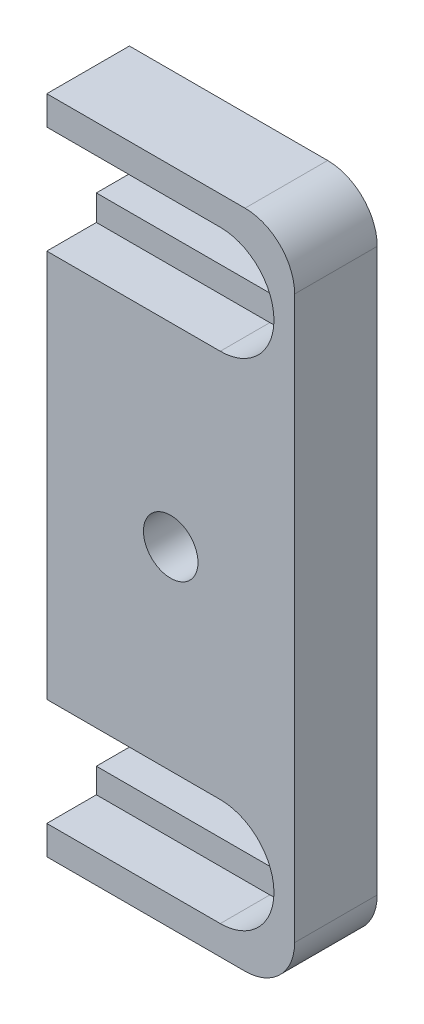
ISO-10303-21;
HEADER;
FILE_DESCRIPTION(('STEP AP214'),'2;1');
FILE_NAME('part.step','',(''),(''),'','','');
FILE_SCHEMA(('AUTOMOTIVE_DESIGN { 1 0 10303 214 1 1 1 1 }'));
ENDSEC;
DATA;
#1=APPLICATION_CONTEXT('core data for automotive mechanical design processes');
#2=APPLICATION_PROTOCOL_DEFINITION('international standard','automotive_design',2000,#1);
#3=PRODUCT_CONTEXT('',#1,'mechanical');
#4=PRODUCT('Part','Part','',(#3));
#5=PRODUCT_RELATED_PRODUCT_CATEGORY('part','',(#4));
#6=PRODUCT_DEFINITION_FORMATION('','',#4);
#7=PRODUCT_DEFINITION_CONTEXT('part definition',#1,'design');
#8=PRODUCT_DEFINITION('design','',#6,#7);
#9=PRODUCT_DEFINITION_SHAPE('','',#8);
#10=(LENGTH_UNIT() NAMED_UNIT(*) SI_UNIT(.MILLI.,.METRE.));
#11=(NAMED_UNIT(*) PLANE_ANGLE_UNIT() SI_UNIT($,.RADIAN.));
#12=(NAMED_UNIT(*) SI_UNIT($,.STERADIAN.) SOLID_ANGLE_UNIT());
#13=UNCERTAINTY_MEASURE_WITH_UNIT(LENGTH_MEASURE(1.E-05),#10,'distance_accuracy_value','');
#14=(GEOMETRIC_REPRESENTATION_CONTEXT(3) GLOBAL_UNCERTAINTY_ASSIGNED_CONTEXT((#13)) GLOBAL_UNIT_ASSIGNED_CONTEXT((#10,
#11,#12)) REPRESENTATION_CONTEXT('',''));
#15=CARTESIAN_POINT('',(0.,0.,0.));
#16=DIRECTION('',(0.,0.,1.));
#17=DIRECTION('',(1.,0.,0.));
#18=AXIS2_PLACEMENT_3D('',#15,#16,#17);
#19=CARTESIAN_POINT('',(0.,0.,0.));
#20=DIRECTION('',(-1.,0.,0.));
#21=DIRECTION('',(0.,-1.,0.));
#22=AXIS2_PLACEMENT_3D('',#19,#20,#21);
#23=PLANE('',#22);
#24=DIRECTION('',(0.,0.,-1.));
#25=VECTOR('',#24,1.);
#26=CARTESIAN_POINT('',(0.,-36.7500000000001,5.));
#27=LINE('',#26,#25);
#28=CARTESIAN_POINT('',(0.,-36.7500000000001,2.));
#29=VERTEX_POINT('',#28);
#30=CARTESIAN_POINT('',(0.,-36.7500000000001,0.));
#31=VERTEX_POINT('',#30);
#32=EDGE_CURVE('E196',#29,#31,#27,.T.);
#33=ORIENTED_EDGE('',*,*,#32,.T.);
#34=DIRECTION('',(0.,-1.,0.));
#35=VECTOR('',#34,1.);
#36=CARTESIAN_POINT('',(0.,0.,0.));
#37=LINE('',#36,#35);
#38=CARTESIAN_POINT('',(0.,-40.,0.));
#39=VERTEX_POINT('',#38);
#40=EDGE_CURVE('E210',#31,#39,#37,.T.);
#41=ORIENTED_EDGE('',*,*,#40,.T.);
#42=DIRECTION('',(0.,0.,1.));
#43=VECTOR('',#42,1.);
#44=CARTESIAN_POINT('',(0.,-40.,0.));
#45=LINE('',#44,#43);
#46=CARTESIAN_POINT('',(0.,-40.,5.));
#47=VERTEX_POINT('',#46);
#48=EDGE_CURVE('E255',#39,#47,#45,.T.);
#49=ORIENTED_EDGE('',*,*,#48,.T.);
#50=DIRECTION('',(0.,-1.,0.));
#51=VECTOR('',#50,1.);
#52=CARTESIAN_POINT('',(0.,0.,5.));
#53=LINE('',#52,#51);
#54=CARTESIAN_POINT('',(0.,-38.25,5.));
#55=VERTEX_POINT('',#54);
#56=EDGE_CURVE('E266',#55,#47,#53,.T.);
#57=ORIENTED_EDGE('',*,*,#56,.F.);
#58=DIRECTION('',(0.,0.,1.));
#59=VECTOR('',#58,1.);
#60=CARTESIAN_POINT('',(0.,-38.25,2.));
#61=LINE('',#60,#59);
#62=CARTESIAN_POINT('',(0.,-38.25,2.));
#63=VERTEX_POINT('',#62);
#64=EDGE_CURVE('E347',#63,#55,#61,.T.);
#65=ORIENTED_EDGE('',*,*,#64,.F.);
#66=DIRECTION('',(0.,-1.,0.));
#67=VECTOR('',#66,1.);
#68=CARTESIAN_POINT('',(0.,-31.7500000000001,2.));
#69=LINE('',#68,#67);
#70=EDGE_CURVE('E213',#29,#63,#69,.T.);
#71=ORIENTED_EDGE('',*,*,#70,.F.);
#72=EDGE_LOOP('',(#33,#41,#49,#57,#65,#71));
#73=FACE_BOUND('',#72,.T.);
#74=ADVANCED_FACE('F44',(#73),#23,.T.);
#75=DIRECTION('',(0.,0.,1.));
#76=VECTOR('',#75,1.);
#77=CARTESIAN_POINT('',(0.,-3.3,0.));
#78=LINE('',#77,#76);
#79=CARTESIAN_POINT('',(0.,-3.3,0.));
#80=VERTEX_POINT('',#79);
#81=CARTESIAN_POINT('',(0.,-3.3,2.));
#82=VERTEX_POINT('',#81);
#83=EDGE_CURVE('E374',#80,#82,#78,.T.);
#84=ORIENTED_EDGE('',*,*,#83,.T.);
#85=DIRECTION('',(0.,-1.,0.));
#86=VECTOR('',#85,1.);
#87=CARTESIAN_POINT('',(0.,-1.75,2.));
#88=LINE('',#87,#86);
#89=CARTESIAN_POINT('',(0.,-1.75,2.));
#90=VERTEX_POINT('',#89);
#91=EDGE_CURVE('E394',#90,#82,#88,.T.);
#92=ORIENTED_EDGE('',*,*,#91,.F.);
#93=DIRECTION('',(0.,0.,1.));
#94=VECTOR('',#93,1.);
#95=CARTESIAN_POINT('',(0.,-1.75,2.));
#96=LINE('',#95,#94);
#97=CARTESIAN_POINT('',(0.,-1.75,5.));
#98=VERTEX_POINT('',#97);
#99=EDGE_CURVE('E263',#90,#98,#96,.T.);
#100=ORIENTED_EDGE('',*,*,#99,.T.);
#101=CARTESIAN_POINT('',(0.,0.,5.));
#102=VERTEX_POINT('',#101);
#103=EDGE_CURVE('E267',#102,#98,#53,.T.);
#104=ORIENTED_EDGE('',*,*,#103,.F.);
#105=DIRECTION('',(0.,0.,1.));
#106=VECTOR('',#105,1.);
#107=CARTESIAN_POINT('',(0.,0.,0.));
#108=LINE('',#107,#106);
#109=CARTESIAN_POINT('',(0.,0.,0.));
#110=VERTEX_POINT('',#109);
#111=EDGE_CURVE('E246',#110,#102,#108,.T.);
#112=ORIENTED_EDGE('',*,*,#111,.F.);
#113=EDGE_CURVE('E226',#110,#80,#37,.T.);
#114=ORIENTED_EDGE('',*,*,#113,.T.);
#115=EDGE_LOOP('',(#84,#92,#100,#104,#112,#114));
#116=FACE_BOUND('',#115,.T.);
#117=ADVANCED_FACE('F437',(#116),#23,.T.);
#118=CARTESIAN_POINT('',(15.,-40.,0.));
#119=DIRECTION('',(1.,0.,0.));
#120=DIRECTION('',(0.,0.,-1.));
#121=AXIS2_PLACEMENT_3D('',#118,#119,#120);
#122=PLANE('',#121);
#123=DIRECTION('',(0.,1.,0.));
#124=VECTOR('',#123,1.);
#125=CARTESIAN_POINT('',(15.,-40.,5.));
#126=LINE('',#125,#124);
#127=CARTESIAN_POINT('',(15.,-37.,5.));
#128=VERTEX_POINT('',#127);
#129=CARTESIAN_POINT('',(15.,-3.,5.));
#130=VERTEX_POINT('',#129);
#131=EDGE_CURVE('E258',#128,#130,#126,.T.);
#132=ORIENTED_EDGE('',*,*,#131,.F.);
#133=DIRECTION('',(0.,0.,1.));
#134=VECTOR('',#133,1.);
#135=CARTESIAN_POINT('',(15.,-37.,0.));
#136=LINE('',#135,#134);
#137=CARTESIAN_POINT('',(15.,-37.,0.));
#138=VERTEX_POINT('',#137);
#139=EDGE_CURVE('E298',#128,#138,#136,.F.);
#140=ORIENTED_EDGE('',*,*,#139,.T.);
#141=DIRECTION('',(0.,1.,0.));
#142=VECTOR('',#141,1.);
#143=CARTESIAN_POINT('',(15.,-40.,0.));
#144=LINE('',#143,#142);
#145=CARTESIAN_POINT('',(15.,-3.,0.));
#146=VERTEX_POINT('',#145);
#147=EDGE_CURVE('E233',#138,#146,#144,.T.);
#148=ORIENTED_EDGE('',*,*,#147,.T.);
#149=DIRECTION('',(0.,0.,1.));
#150=VECTOR('',#149,1.);
#151=CARTESIAN_POINT('',(15.,-3.,0.));
#152=LINE('',#151,#150);
#153=EDGE_CURVE('E294',#146,#130,#152,.T.);
#154=ORIENTED_EDGE('',*,*,#153,.T.);
#155=EDGE_LOOP('',(#132,#140,#148,#154));
#156=FACE_BOUND('',#155,.T.);
#157=ADVANCED_FACE('F433',(#156),#122,.T.);
#158=CARTESIAN_POINT('',(0.,-40.,0.));
#159=DIRECTION('',(0.,-1.,0.));
#160=DIRECTION('',(1.,0.,0.));
#161=AXIS2_PLACEMENT_3D('',#158,#159,#160);
#162=PLANE('',#161);
#163=DIRECTION('',(1.,0.,0.));
#164=VECTOR('',#163,1.);
#165=CARTESIAN_POINT('',(0.,-40.,0.));
#166=LINE('',#165,#164);
#167=CARTESIAN_POINT('',(12.,-40.,0.));
#168=VERTEX_POINT('',#167);
#169=EDGE_CURVE('E221',#39,#168,#166,.T.);
#170=ORIENTED_EDGE('',*,*,#169,.T.);
#171=DIRECTION('',(0.,0.,1.));
#172=VECTOR('',#171,1.);
#173=CARTESIAN_POINT('',(12.,-40.,0.));
#174=LINE('',#173,#172);
#175=CARTESIAN_POINT('',(12.,-40.,5.));
#176=VERTEX_POINT('',#175);
#177=EDGE_CURVE('E285',#168,#176,#174,.T.);
#178=ORIENTED_EDGE('',*,*,#177,.T.);
#179=DIRECTION('',(1.,0.,0.));
#180=VECTOR('',#179,1.);
#181=CARTESIAN_POINT('',(0.,-40.,5.));
#182=LINE('',#181,#180);
#183=EDGE_CURVE('E270',#47,#176,#182,.T.);
#184=ORIENTED_EDGE('',*,*,#183,.F.);
#185=ORIENTED_EDGE('',*,*,#48,.F.);
#186=EDGE_LOOP('',(#170,#178,#184,#185));
#187=FACE_BOUND('',#186,.T.);
#188=ADVANCED_FACE('F310',(#187),#162,.T.);
#189=DIRECTION('',(0.,0.,-1.));
#190=VECTOR('',#189,1.);
#191=CARTESIAN_POINT('',(0.,-33.25,5.));
#192=LINE('',#191,#190);
#193=CARTESIAN_POINT('',(0.,-33.25,2.));
#194=VERTEX_POINT('',#193);
#195=CARTESIAN_POINT('',(0.,-33.25,0.));
#196=VERTEX_POINT('',#195);
#197=EDGE_CURVE('E215',#194,#196,#192,.T.);
#198=ORIENTED_EDGE('',*,*,#197,.F.);
#199=CARTESIAN_POINT('',(0.,-31.7500000000001,2.));
#200=VERTEX_POINT('',#199);
#201=EDGE_CURVE('E342',#200,#194,#69,.T.);
#202=ORIENTED_EDGE('',*,*,#201,.F.);
#203=DIRECTION('',(0.,0.,1.));
#204=VECTOR('',#203,1.);
#205=CARTESIAN_POINT('',(0.,-31.7500000000001,2.));
#206=LINE('',#205,#204);
#207=CARTESIAN_POINT('',(0.,-31.7500000000001,5.));
#208=VERTEX_POINT('',#207);
#209=EDGE_CURVE('E340',#200,#208,#206,.T.);
#210=ORIENTED_EDGE('',*,*,#209,.T.);
#211=CARTESIAN_POINT('',(0.,-8.25,5.));
#212=VERTEX_POINT('',#211);
#213=EDGE_CURVE('E271',#212,#208,#53,.T.);
#214=ORIENTED_EDGE('',*,*,#213,.F.);
#215=DIRECTION('',(0.,0.,1.));
#216=VECTOR('',#215,1.);
#217=CARTESIAN_POINT('',(0.,-8.25,2.));
#218=LINE('',#217,#216);
#219=CARTESIAN_POINT('',(0.,-8.25,2.));
#220=VERTEX_POINT('',#219);
#221=EDGE_CURVE('E338',#220,#212,#218,.T.);
#222=ORIENTED_EDGE('',*,*,#221,.F.);
#223=CARTESIAN_POINT('',(0.,-6.7,2.));
#224=VERTEX_POINT('',#223);
#225=EDGE_CURVE('E399',#224,#220,#88,.T.);
#226=ORIENTED_EDGE('',*,*,#225,.F.);
#227=DIRECTION('',(0.,0.,1.));
#228=VECTOR('',#227,1.);
#229=CARTESIAN_POINT('',(0.,-6.7,0.));
#230=LINE('',#229,#228);
#231=CARTESIAN_POINT('',(0.,-6.7,0.));
#232=VERTEX_POINT('',#231);
#233=EDGE_CURVE('E389',#232,#224,#230,.T.);
#234=ORIENTED_EDGE('',*,*,#233,.F.);
#235=EDGE_CURVE('E223',#232,#196,#37,.T.);
#236=ORIENTED_EDGE('',*,*,#235,.T.);
#237=EDGE_LOOP('',(#198,#202,#210,#214,#222,#226,#234,#236));
#238=FACE_BOUND('',#237,.T.);
#239=ADVANCED_FACE('F336',(#238),#23,.T.);
#240=CARTESIAN_POINT('',(15.,0.,0.));
#241=DIRECTION('',(0.,1.,0.));
#242=DIRECTION('',(0.,0.,1.));
#243=AXIS2_PLACEMENT_3D('',#240,#241,#242);
#244=PLANE('',#243);
#245=DIRECTION('',(-1.,0.,0.));
#246=VECTOR('',#245,1.);
#247=CARTESIAN_POINT('',(15.,0.,5.));
#248=LINE('',#247,#246);
#249=CARTESIAN_POINT('',(12.,0.,5.));
#250=VERTEX_POINT('',#249);
#251=EDGE_CURVE('E262',#250,#102,#248,.T.);
#252=ORIENTED_EDGE('',*,*,#251,.F.);
#253=DIRECTION('',(0.,0.,1.));
#254=VECTOR('',#253,1.);
#255=CARTESIAN_POINT('',(12.,0.,0.));
#256=LINE('',#255,#254);
#257=CARTESIAN_POINT('',(12.,0.,0.));
#258=VERTEX_POINT('',#257);
#259=EDGE_CURVE('E11',#250,#258,#256,.F.);
#260=ORIENTED_EDGE('',*,*,#259,.T.);
#261=DIRECTION('',(-1.,0.,0.));
#262=VECTOR('',#261,1.);
#263=CARTESIAN_POINT('',(15.,0.,0.));
#264=LINE('',#263,#262);
#265=EDGE_CURVE('E224',#258,#110,#264,.T.);
#266=ORIENTED_EDGE('',*,*,#265,.T.);
#267=ORIENTED_EDGE('',*,*,#111,.T.);
#268=EDGE_LOOP('',(#252,#260,#266,#267));
#269=FACE_BOUND('',#268,.T.);
#270=ADVANCED_FACE('F435',(#269),#244,.T.);
#271=CARTESIAN_POINT('',(0.,0.,0.));
#272=DIRECTION('',(0.,0.,1.));
#273=DIRECTION('',(1.,0.,0.));
#274=AXIS2_PLACEMENT_3D('',#271,#272,#273);
#275=PLANE('',#274);
#276=CARTESIAN_POINT('',(7.50000000000001,-20.,0.));
#277=DIRECTION('',(0.,0.,1.));
#278=DIRECTION('',(1.,0.,0.));
#279=AXIS2_PLACEMENT_3D('',#276,#277,#278);
#280=CIRCLE('',#279,1.65);
#281=CARTESIAN_POINT('',(9.15000000000001,-20.,0.));
#282=VERTEX_POINT('',#281);
#283=EDGE_CURVE('E205',#282,#282,#280,.T.);
#284=ORIENTED_EDGE('',*,*,#283,.T.);
#285=EDGE_LOOP('',(#284));
#286=FACE_BOUND('',#285,.T.);
#287=ORIENTED_EDGE('',*,*,#147,.F.);
#288=CARTESIAN_POINT('',(12.,-37.,0.));
#289=DIRECTION('',(0.,0.,1.));
#290=DIRECTION('',(1.,0.,0.));
#291=AXIS2_PLACEMENT_3D('',#288,#289,#290);
#292=CIRCLE('',#291,3.);
#293=EDGE_CURVE('E53',#138,#168,#292,.F.);
#294=ORIENTED_EDGE('',*,*,#293,.T.);
#295=ORIENTED_EDGE('',*,*,#169,.F.);
#296=ORIENTED_EDGE('',*,*,#40,.F.);
#297=DIRECTION('',(-1.,0.,0.));
#298=VECTOR('',#297,1.);
#299=CARTESIAN_POINT('',(10.5,-36.7500000000001,0.));
#300=LINE('',#299,#298);
#301=CARTESIAN_POINT('',(10.5,-36.7500000000001,0.));
#302=VERTEX_POINT('',#301);
#303=EDGE_CURVE('E193',#302,#31,#300,.T.);
#304=ORIENTED_EDGE('',*,*,#303,.F.);
#305=CARTESIAN_POINT('',(10.5,-35.,0.));
#306=DIRECTION('',(0.,0.,-1.));
#307=DIRECTION('',(-1.,0.,0.));
#308=AXIS2_PLACEMENT_3D('',#305,#306,#307);
#309=CIRCLE('',#308,1.75000000000003);
#310=CARTESIAN_POINT('',(10.5,-33.25,0.));
#311=VERTEX_POINT('',#310);
#312=EDGE_CURVE('E216',#311,#302,#309,.T.);
#313=ORIENTED_EDGE('',*,*,#312,.F.);
#314=DIRECTION('',(1.,0.,0.));
#315=VECTOR('',#314,1.);
#316=CARTESIAN_POINT('',(0.,-33.25,0.));
#317=LINE('',#316,#315);
#318=EDGE_CURVE('E204',#196,#311,#317,.T.);
#319=ORIENTED_EDGE('',*,*,#318,.F.);
#320=ORIENTED_EDGE('',*,*,#235,.F.);
#321=DIRECTION('',(1.,0.,0.));
#322=VECTOR('',#321,1.);
#323=CARTESIAN_POINT('',(0.,-6.7,0.));
#324=LINE('',#323,#322);
#325=CARTESIAN_POINT('',(10.5,-6.7,0.));
#326=VERTEX_POINT('',#325);
#327=EDGE_CURVE('E365',#232,#326,#324,.T.);
#328=ORIENTED_EDGE('',*,*,#327,.T.);
#329=CARTESIAN_POINT('',(10.5,-5.,0.));
#330=DIRECTION('',(0.,0.,1.));
#331=DIRECTION('',(1.,0.,0.));
#332=AXIS2_PLACEMENT_3D('',#329,#330,#331);
#333=CIRCLE('',#332,1.7);
#334=CARTESIAN_POINT('',(10.5,-3.30000000000001,0.));
#335=VERTEX_POINT('',#334);
#336=EDGE_CURVE('E370',#326,#335,#333,.T.);
#337=ORIENTED_EDGE('',*,*,#336,.T.);
#338=DIRECTION('',(-1.,0.,0.));
#339=VECTOR('',#338,1.);
#340=CARTESIAN_POINT('',(10.5,-3.3,0.));
#341=LINE('',#340,#339);
#342=EDGE_CURVE('E361',#335,#80,#341,.T.);
#343=ORIENTED_EDGE('',*,*,#342,.T.);
#344=ORIENTED_EDGE('',*,*,#113,.F.);
#345=ORIENTED_EDGE('',*,*,#265,.F.);
#346=CARTESIAN_POINT('',(12.,-3.,0.));
#347=DIRECTION('',(0.,0.,1.));
#348=DIRECTION('',(1.,0.,0.));
#349=AXIS2_PLACEMENT_3D('',#346,#347,#348);
#350=CIRCLE('',#349,3.);
#351=EDGE_CURVE('E65',#258,#146,#350,.F.);
#352=ORIENTED_EDGE('',*,*,#351,.T.);
#353=EDGE_LOOP('',(#287,#294,#295,#296,#304,#313,#319,#320,#328,#337,#343,#344,#345,#352));
#354=FACE_BOUND('',#353,.T.);
#355=ADVANCED_FACE('F219',(#286,#354),#275,.F.);
#356=CARTESIAN_POINT('',(0.,0.,5.));
#357=DIRECTION('',(0.,0.,1.));
#358=DIRECTION('',(1.,0.,0.));
#359=AXIS2_PLACEMENT_3D('',#356,#357,#358);
#360=PLANE('',#359);
#361=CARTESIAN_POINT('',(7.50000000000001,-20.,5.));
#362=DIRECTION('',(0.,0.,1.));
#363=DIRECTION('',(1.,0.,0.));
#364=AXIS2_PLACEMENT_3D('',#361,#362,#363);
#365=CIRCLE('',#364,1.65);
#366=CARTESIAN_POINT('',(9.15000000000001,-20.,5.));
#367=VERTEX_POINT('',#366);
#368=EDGE_CURVE('E586',#367,#367,#365,.T.);
#369=ORIENTED_EDGE('',*,*,#368,.F.);
#370=EDGE_LOOP('',(#369));
#371=FACE_BOUND('',#370,.T.);
#372=ORIENTED_EDGE('',*,*,#183,.T.);
#373=CARTESIAN_POINT('',(12.,-37.,5.));
#374=DIRECTION('',(0.,0.,1.));
#375=DIRECTION('',(1.,0.,0.));
#376=AXIS2_PLACEMENT_3D('',#373,#374,#375);
#377=CIRCLE('',#376,3.);
#378=EDGE_CURVE('E291',#176,#128,#377,.T.);
#379=ORIENTED_EDGE('',*,*,#378,.T.);
#380=ORIENTED_EDGE('',*,*,#131,.T.);
#381=CARTESIAN_POINT('',(12.,-3.,5.));
#382=DIRECTION('',(0.,0.,1.));
#383=DIRECTION('',(1.,0.,0.));
#384=AXIS2_PLACEMENT_3D('',#381,#382,#383);
#385=CIRCLE('',#384,3.);
#386=EDGE_CURVE('E288',#130,#250,#385,.T.);
#387=ORIENTED_EDGE('',*,*,#386,.T.);
#388=ORIENTED_EDGE('',*,*,#251,.T.);
#389=ORIENTED_EDGE('',*,*,#103,.T.);
#390=DIRECTION('',(-1.,0.,0.));
#391=VECTOR('',#390,1.);
#392=CARTESIAN_POINT('',(10.5,-1.75,5.));
#393=LINE('',#392,#391);
#394=CARTESIAN_POINT('',(10.5,-1.75,5.));
#395=VERTEX_POINT('',#394);
#396=EDGE_CURVE('E416',#395,#98,#393,.T.);
#397=ORIENTED_EDGE('',*,*,#396,.F.);
#398=CARTESIAN_POINT('',(10.5,-5.,5.));
#399=DIRECTION('',(0.,0.,1.));
#400=DIRECTION('',(1.,0.,0.));
#401=AXIS2_PLACEMENT_3D('',#398,#399,#400);
#402=CIRCLE('',#401,3.25);
#403=CARTESIAN_POINT('',(10.5,-8.25,5.));
#404=VERTEX_POINT('',#403);
#405=EDGE_CURVE('E412',#404,#395,#402,.T.);
#406=ORIENTED_EDGE('',*,*,#405,.F.);
#407=DIRECTION('',(1.,0.,0.));
#408=VECTOR('',#407,1.);
#409=CARTESIAN_POINT('',(0.,-8.25,5.));
#410=LINE('',#409,#408);
#411=EDGE_CURVE('E331',#212,#404,#410,.T.);
#412=ORIENTED_EDGE('',*,*,#411,.F.);
#413=ORIENTED_EDGE('',*,*,#213,.T.);
#414=DIRECTION('',(-1.,0.,0.));
#415=VECTOR('',#414,1.);
#416=CARTESIAN_POINT('',(10.5,-31.7500000000001,5.));
#417=LINE('',#416,#415);
#418=CARTESIAN_POINT('',(10.5,-31.7500000000001,5.));
#419=VERTEX_POINT('',#418);
#420=EDGE_CURVE('E328',#419,#208,#417,.T.);
#421=ORIENTED_EDGE('',*,*,#420,.F.);
#422=CARTESIAN_POINT('',(10.5,-35.,5.));
#423=DIRECTION('',(0.,0.,1.));
#424=DIRECTION('',(1.,0.,0.));
#425=AXIS2_PLACEMENT_3D('',#422,#423,#424);
#426=CIRCLE('',#425,3.24999999999998);
#427=CARTESIAN_POINT('',(10.5,-38.25,5.));
#428=VERTEX_POINT('',#427);
#429=EDGE_CURVE('E556',#428,#419,#426,.T.);
#430=ORIENTED_EDGE('',*,*,#429,.F.);
#431=DIRECTION('',(1.,0.,0.));
#432=VECTOR('',#431,1.);
#433=CARTESIAN_POINT('',(0.,-38.25,5.));
#434=LINE('',#433,#432);
#435=EDGE_CURVE('E318',#55,#428,#434,.T.);
#436=ORIENTED_EDGE('',*,*,#435,.F.);
#437=ORIENTED_EDGE('',*,*,#56,.T.);
#438=EDGE_LOOP('',(#372,#379,#380,#387,#388,#389,#397,#406,#412,#413,#421,#430,#436,#437));
#439=FACE_BOUND('',#438,.T.);
#440=ADVANCED_FACE('F312',(#371,#439),#360,.T.);
#441=CARTESIAN_POINT('',(10.5,-1.75,2.));
#442=DIRECTION('',(0.,1.,0.));
#443=DIRECTION('',(-1.,0.,0.));
#444=AXIS2_PLACEMENT_3D('',#441,#442,#443);
#445=PLANE('',#444);
#446=ORIENTED_EDGE('',*,*,#396,.T.);
#447=ORIENTED_EDGE('',*,*,#99,.F.);
#448=DIRECTION('',(-1.,0.,0.));
#449=VECTOR('',#448,1.);
#450=CARTESIAN_POINT('',(10.5,-1.75,2.));
#451=LINE('',#450,#449);
#452=CARTESIAN_POINT('',(10.5,-1.75,2.));
#453=VERTEX_POINT('',#452);
#454=EDGE_CURVE('E406',#453,#90,#451,.T.);
#455=ORIENTED_EDGE('',*,*,#454,.F.);
#456=DIRECTION('',(0.,0.,1.));
#457=VECTOR('',#456,1.);
#458=CARTESIAN_POINT('',(10.5,-1.75,2.));
#459=LINE('',#458,#457);
#460=EDGE_CURVE('E422',#453,#395,#459,.T.);
#461=ORIENTED_EDGE('',*,*,#460,.T.);
#462=EDGE_LOOP('',(#446,#447,#455,#461));
#463=FACE_BOUND('',#462,.T.);
#464=ADVANCED_FACE('F441',(#463),#445,.F.);
#465=CARTESIAN_POINT('',(10.5,-5.,2.));
#466=DIRECTION('',(0.,0.,1.));
#467=DIRECTION('',(1.,0.,0.));
#468=AXIS2_PLACEMENT_3D('',#465,#466,#467);
#469=CYLINDRICAL_SURFACE('',#468,3.25);
#470=ORIENTED_EDGE('',*,*,#405,.T.);
#471=ORIENTED_EDGE('',*,*,#460,.F.);
#472=CARTESIAN_POINT('',(10.5,-5.,2.));
#473=DIRECTION('',(0.,0.,1.));
#474=DIRECTION('',(1.,0.,0.));
#475=AXIS2_PLACEMENT_3D('',#472,#473,#474);
#476=CIRCLE('',#475,3.25);
#477=CARTESIAN_POINT('',(10.5,-8.25,2.));
#478=VERTEX_POINT('',#477);
#479=EDGE_CURVE('E403',#478,#453,#476,.T.);
#480=ORIENTED_EDGE('',*,*,#479,.F.);
#481=DIRECTION('',(0.,0.,1.));
#482=VECTOR('',#481,1.);
#483=CARTESIAN_POINT('',(10.5,-8.25,2.));
#484=LINE('',#483,#482);
#485=EDGE_CURVE('E425',#478,#404,#484,.T.);
#486=ORIENTED_EDGE('',*,*,#485,.T.);
#487=EDGE_LOOP('',(#470,#471,#480,#486));
#488=FACE_BOUND('',#487,.T.);
#489=ADVANCED_FACE('F445',(#488),#469,.F.);
#490=CARTESIAN_POINT('',(0.,-8.25,2.));
#491=DIRECTION('',(0.,-1.,0.));
#492=DIRECTION('',(0.,0.,-1.));
#493=AXIS2_PLACEMENT_3D('',#490,#491,#492);
#494=PLANE('',#493);
#495=ORIENTED_EDGE('',*,*,#411,.T.);
#496=ORIENTED_EDGE('',*,*,#485,.F.);
#497=DIRECTION('',(1.,0.,0.));
#498=VECTOR('',#497,1.);
#499=CARTESIAN_POINT('',(0.,-8.25,2.));
#500=LINE('',#499,#498);
#501=EDGE_CURVE('E398',#220,#478,#500,.T.);
#502=ORIENTED_EDGE('',*,*,#501,.F.);
#503=ORIENTED_EDGE('',*,*,#221,.T.);
#504=EDGE_LOOP('',(#495,#496,#502,#503));
#505=FACE_BOUND('',#504,.T.);
#506=ADVANCED_FACE('F448',(#505),#494,.F.);
#507=CARTESIAN_POINT('',(10.5,-5.,2.));
#508=DIRECTION('',(0.,0.,1.));
#509=DIRECTION('',(1.,0.,0.));
#510=AXIS2_PLACEMENT_3D('',#507,#508,#509);
#511=PLANE('',#510);
#512=DIRECTION('',(-1.,0.,0.));
#513=VECTOR('',#512,1.);
#514=CARTESIAN_POINT('',(10.5,-3.3,2.));
#515=LINE('',#514,#513);
#516=CARTESIAN_POINT('',(10.5,-3.30000000000001,2.));
#517=VERTEX_POINT('',#516);
#518=EDGE_CURVE('E375',#517,#82,#515,.T.);
#519=ORIENTED_EDGE('',*,*,#518,.F.);
#520=CARTESIAN_POINT('',(10.5,-5.,2.));
#521=DIRECTION('',(0.,0.,1.));
#522=DIRECTION('',(1.,0.,0.));
#523=AXIS2_PLACEMENT_3D('',#520,#521,#522);
#524=CIRCLE('',#523,1.7);
#525=CARTESIAN_POINT('',(10.5,-6.7,2.));
#526=VERTEX_POINT('',#525);
#527=EDGE_CURVE('E366',#526,#517,#524,.T.);
#528=ORIENTED_EDGE('',*,*,#527,.F.);
#529=DIRECTION('',(1.,0.,0.));
#530=VECTOR('',#529,1.);
#531=CARTESIAN_POINT('',(0.,-6.7,2.));
#532=LINE('',#531,#530);
#533=EDGE_CURVE('E377',#224,#526,#532,.T.);
#534=ORIENTED_EDGE('',*,*,#533,.F.);
#535=ORIENTED_EDGE('',*,*,#225,.T.);
#536=ORIENTED_EDGE('',*,*,#501,.T.);
#537=ORIENTED_EDGE('',*,*,#479,.T.);
#538=ORIENTED_EDGE('',*,*,#454,.T.);
#539=ORIENTED_EDGE('',*,*,#91,.T.);
#540=EDGE_LOOP('',(#519,#528,#534,#535,#536,#537,#538,#539));
#541=FACE_BOUND('',#540,.T.);
#542=ADVANCED_FACE('F451',(#541),#511,.T.);
#543=CARTESIAN_POINT('',(10.5,-3.3,0.));
#544=DIRECTION('',(0.,1.,0.));
#545=DIRECTION('',(-1.,0.,0.));
#546=AXIS2_PLACEMENT_3D('',#543,#544,#545);
#547=PLANE('',#546);
#548=ORIENTED_EDGE('',*,*,#518,.T.);
#549=ORIENTED_EDGE('',*,*,#83,.F.);
#550=ORIENTED_EDGE('',*,*,#342,.F.);
#551=DIRECTION('',(0.,0.,1.));
#552=VECTOR('',#551,1.);
#553=CARTESIAN_POINT('',(10.5,-3.30000000000001,0.));
#554=LINE('',#553,#552);
#555=EDGE_CURVE('E384',#335,#517,#554,.T.);
#556=ORIENTED_EDGE('',*,*,#555,.T.);
#557=EDGE_LOOP('',(#548,#549,#550,#556));
#558=FACE_BOUND('',#557,.T.);
#559=ADVANCED_FACE('F662',(#558),#547,.F.);
#560=CARTESIAN_POINT('',(10.5,-5.,0.));
#561=DIRECTION('',(0.,0.,1.));
#562=DIRECTION('',(1.,0.,0.));
#563=AXIS2_PLACEMENT_3D('',#560,#561,#562);
#564=CYLINDRICAL_SURFACE('',#563,1.7);
#565=ORIENTED_EDGE('',*,*,#527,.T.);
#566=ORIENTED_EDGE('',*,*,#555,.F.);
#567=ORIENTED_EDGE('',*,*,#336,.F.);
#568=DIRECTION('',(0.,0.,1.));
#569=VECTOR('',#568,1.);
#570=CARTESIAN_POINT('',(10.5,-6.7,0.));
#571=LINE('',#570,#569);
#572=EDGE_CURVE('E387',#326,#526,#571,.T.);
#573=ORIENTED_EDGE('',*,*,#572,.T.);
#574=EDGE_LOOP('',(#565,#566,#567,#573));
#575=FACE_BOUND('',#574,.T.);
#576=ADVANCED_FACE('F659',(#575),#564,.F.);
#577=CARTESIAN_POINT('',(0.,-6.7,0.));
#578=DIRECTION('',(0.,-1.,0.));
#579=DIRECTION('',(1.,0.,0.));
#580=AXIS2_PLACEMENT_3D('',#577,#578,#579);
#581=PLANE('',#580);
#582=ORIENTED_EDGE('',*,*,#533,.T.);
#583=ORIENTED_EDGE('',*,*,#572,.F.);
#584=ORIENTED_EDGE('',*,*,#327,.F.);
#585=ORIENTED_EDGE('',*,*,#233,.T.);
#586=EDGE_LOOP('',(#582,#583,#584,#585));
#587=FACE_BOUND('',#586,.T.);
#588=ADVANCED_FACE('F657',(#587),#581,.F.);
#589=CARTESIAN_POINT('',(10.5,-35.,2.));
#590=DIRECTION('',(0.,0.,1.));
#591=DIRECTION('',(1.,0.,0.));
#592=AXIS2_PLACEMENT_3D('',#589,#590,#591);
#593=CYLINDRICAL_SURFACE('',#592,3.24999999999998);
#594=ORIENTED_EDGE('',*,*,#429,.T.);
#595=DIRECTION('',(0.,0.,1.));
#596=VECTOR('',#595,1.);
#597=CARTESIAN_POINT('',(10.5,-31.7500000000001,2.));
#598=LINE('',#597,#596);
#599=CARTESIAN_POINT('',(10.5,-31.7500000000001,2.));
#600=VERTEX_POINT('',#599);
#601=EDGE_CURVE('E348',#600,#419,#598,.T.);
#602=ORIENTED_EDGE('',*,*,#601,.F.);
#603=CARTESIAN_POINT('',(10.5,-35.,2.));
#604=DIRECTION('',(0.,0.,1.));
#605=DIRECTION('',(1.,0.,0.));
#606=AXIS2_PLACEMENT_3D('',#603,#604,#605);
#607=CIRCLE('',#606,3.24999999999998);
#608=CARTESIAN_POINT('',(10.5,-38.25,2.));
#609=VERTEX_POINT('',#608);
#610=EDGE_CURVE('E545',#609,#600,#607,.T.);
#611=ORIENTED_EDGE('',*,*,#610,.F.);
#612=DIRECTION('',(0.,0.,1.));
#613=VECTOR('',#612,1.);
#614=CARTESIAN_POINT('',(10.5,-38.25,2.));
#615=LINE('',#614,#613);
#616=EDGE_CURVE('E353',#609,#428,#615,.T.);
#617=ORIENTED_EDGE('',*,*,#616,.T.);
#618=EDGE_LOOP('',(#594,#602,#611,#617));
#619=FACE_BOUND('',#618,.T.);
#620=ADVANCED_FACE('F651',(#619),#593,.F.);
#621=CARTESIAN_POINT('',(0.,-38.25,2.));
#622=DIRECTION('',(0.,-1.,0.));
#623=DIRECTION('',(0.,0.,-1.));
#624=AXIS2_PLACEMENT_3D('',#621,#622,#623);
#625=PLANE('',#624);
#626=ORIENTED_EDGE('',*,*,#435,.T.);
#627=ORIENTED_EDGE('',*,*,#616,.F.);
#628=DIRECTION('',(1.,0.,0.));
#629=VECTOR('',#628,1.);
#630=CARTESIAN_POINT('',(0.,-38.25,2.));
#631=LINE('',#630,#629);
#632=EDGE_CURVE('E357',#63,#609,#631,.T.);
#633=ORIENTED_EDGE('',*,*,#632,.F.);
#634=ORIENTED_EDGE('',*,*,#64,.T.);
#635=EDGE_LOOP('',(#626,#627,#633,#634));
#636=FACE_BOUND('',#635,.T.);
#637=ADVANCED_FACE('F648',(#636),#625,.F.);
#638=CARTESIAN_POINT('',(10.5,-31.7500000000001,2.));
#639=DIRECTION('',(0.,1.,0.));
#640=DIRECTION('',(0.,0.,1.));
#641=AXIS2_PLACEMENT_3D('',#638,#639,#640);
#642=PLANE('',#641);
#643=ORIENTED_EDGE('',*,*,#420,.T.);
#644=ORIENTED_EDGE('',*,*,#209,.F.);
#645=DIRECTION('',(-1.,0.,0.));
#646=VECTOR('',#645,1.);
#647=CARTESIAN_POINT('',(10.5,-31.7500000000001,2.));
#648=LINE('',#647,#646);
#649=EDGE_CURVE('E542',#600,#200,#648,.T.);
#650=ORIENTED_EDGE('',*,*,#649,.F.);
#651=ORIENTED_EDGE('',*,*,#601,.T.);
#652=EDGE_LOOP('',(#643,#644,#650,#651));
#653=FACE_BOUND('',#652,.T.);
#654=ADVANCED_FACE('F646',(#653),#642,.F.);
#655=CARTESIAN_POINT('',(10.5,-35.,2.));
#656=DIRECTION('',(0.,0.,1.));
#657=DIRECTION('',(1.,0.,0.));
#658=AXIS2_PLACEMENT_3D('',#655,#656,#657);
#659=PLANE('',#658);
#660=DIRECTION('',(1.,0.,0.));
#661=VECTOR('',#660,1.);
#662=CARTESIAN_POINT('',(10.5,-36.7500000000001,2.));
#663=LINE('',#662,#661);
#664=CARTESIAN_POINT('',(10.5,-36.7500000000001,2.));
#665=VERTEX_POINT('',#664);
#666=EDGE_CURVE('E282',#29,#665,#663,.T.);
#667=ORIENTED_EDGE('',*,*,#666,.F.);
#668=ORIENTED_EDGE('',*,*,#70,.T.);
#669=ORIENTED_EDGE('',*,*,#632,.T.);
#670=ORIENTED_EDGE('',*,*,#610,.T.);
#671=ORIENTED_EDGE('',*,*,#649,.T.);
#672=ORIENTED_EDGE('',*,*,#201,.T.);
#673=DIRECTION('',(-1.,0.,0.));
#674=VECTOR('',#673,1.);
#675=CARTESIAN_POINT('',(10.5,-33.25,2.));
#676=LINE('',#675,#674);
#677=CARTESIAN_POINT('',(10.5,-33.25,2.));
#678=VERTEX_POINT('',#677);
#679=EDGE_CURVE('E275',#678,#194,#676,.T.);
#680=ORIENTED_EDGE('',*,*,#679,.F.);
#681=CARTESIAN_POINT('',(10.5,-35.,2.));
#682=DIRECTION('',(0.,0.,1.));
#683=DIRECTION('',(1.,0.,0.));
#684=AXIS2_PLACEMENT_3D('',#681,#682,#683);
#685=CIRCLE('',#684,1.75000000000003);
#686=EDGE_CURVE('E278',#665,#678,#685,.T.);
#687=ORIENTED_EDGE('',*,*,#686,.F.);
#688=EDGE_LOOP('',(#667,#668,#669,#670,#671,#672,#680,#687));
#689=FACE_BOUND('',#688,.T.);
#690=ADVANCED_FACE('F643',(#689),#659,.T.);
#691=CARTESIAN_POINT('',(10.5,-36.7500000000001,5.));
#692=DIRECTION('',(0.,-1.,0.));
#693=DIRECTION('',(0.,0.,-1.));
#694=AXIS2_PLACEMENT_3D('',#691,#692,#693);
#695=PLANE('',#694);
#696=ORIENTED_EDGE('',*,*,#666,.T.);
#697=DIRECTION('',(0.,0.,-1.));
#698=VECTOR('',#697,1.);
#699=CARTESIAN_POINT('',(10.5,-36.7500000000001,5.));
#700=LINE('',#699,#698);
#701=EDGE_CURVE('E199',#665,#302,#700,.T.);
#702=ORIENTED_EDGE('',*,*,#701,.T.);
#703=ORIENTED_EDGE('',*,*,#303,.T.);
#704=ORIENTED_EDGE('',*,*,#32,.F.);
#705=EDGE_LOOP('',(#696,#702,#703,#704));
#706=FACE_BOUND('',#705,.T.);
#707=ADVANCED_FACE('F195',(#706),#695,.F.);
#708=CARTESIAN_POINT('',(10.5,-35.,5.));
#709=DIRECTION('',(0.,0.,-1.));
#710=DIRECTION('',(-1.,0.,0.));
#711=AXIS2_PLACEMENT_3D('',#708,#709,#710);
#712=CYLINDRICAL_SURFACE('',#711,1.75000000000003);
#713=ORIENTED_EDGE('',*,*,#686,.T.);
#714=DIRECTION('',(0.,0.,-1.));
#715=VECTOR('',#714,1.);
#716=CARTESIAN_POINT('',(10.5,-33.25,5.));
#717=LINE('',#716,#715);
#718=EDGE_CURVE('E564',#678,#311,#717,.T.);
#719=ORIENTED_EDGE('',*,*,#718,.T.);
#720=ORIENTED_EDGE('',*,*,#312,.T.);
#721=ORIENTED_EDGE('',*,*,#701,.F.);
#722=EDGE_LOOP('',(#713,#719,#720,#721));
#723=FACE_BOUND('',#722,.T.);
#724=ADVANCED_FACE('F633',(#723),#712,.F.);
#725=CARTESIAN_POINT('',(0.,-33.25,5.));
#726=DIRECTION('',(0.,1.,0.));
#727=DIRECTION('',(0.,0.,1.));
#728=AXIS2_PLACEMENT_3D('',#725,#726,#727);
#729=PLANE('',#728);
#730=ORIENTED_EDGE('',*,*,#679,.T.);
#731=ORIENTED_EDGE('',*,*,#197,.T.);
#732=ORIENTED_EDGE('',*,*,#318,.T.);
#733=ORIENTED_EDGE('',*,*,#718,.F.);
#734=EDGE_LOOP('',(#730,#731,#732,#733));
#735=FACE_BOUND('',#734,.T.);
#736=ADVANCED_FACE('F627',(#735),#729,.F.);
#737=CARTESIAN_POINT('',(7.50000000000001,-20.,5.));
#738=DIRECTION('',(0.,0.,1.));
#739=DIRECTION('',(1.,0.,0.));
#740=AXIS2_PLACEMENT_3D('',#737,#738,#739);
#741=CYLINDRICAL_SURFACE('',#740,1.65);
#742=ORIENTED_EDGE('',*,*,#283,.F.);
#743=EDGE_LOOP('',(#742));
#744=FACE_BOUND('',#743,.T.);
#745=ORIENTED_EDGE('',*,*,#368,.T.);
#746=EDGE_LOOP('',(#745));
#747=FACE_BOUND('',#746,.T.);
#748=ADVANCED_FACE('F593',(#744,#747),#741,.F.);
#749=CARTESIAN_POINT('',(12.,-37.,0.));
#750=DIRECTION('',(0.,0.,1.));
#751=DIRECTION('',(1.,0.,0.));
#752=AXIS2_PLACEMENT_3D('',#749,#750,#751);
#753=CYLINDRICAL_SURFACE('',#752,3.);
#754=ORIENTED_EDGE('',*,*,#293,.F.);
#755=ORIENTED_EDGE('',*,*,#139,.F.);
#756=ORIENTED_EDGE('',*,*,#378,.F.);
#757=ORIENTED_EDGE('',*,*,#177,.F.);
#758=EDGE_LOOP('',(#754,#755,#756,#757));
#759=FACE_BOUND('',#758,.T.);
#760=ADVANCED_FACE('F308',(#759),#753,.T.);
#761=CARTESIAN_POINT('',(12.,-3.,0.));
#762=DIRECTION('',(0.,0.,1.));
#763=DIRECTION('',(1.,0.,0.));
#764=AXIS2_PLACEMENT_3D('',#761,#762,#763);
#765=CYLINDRICAL_SURFACE('',#764,3.);
#766=ORIENTED_EDGE('',*,*,#351,.F.);
#767=ORIENTED_EDGE('',*,*,#259,.F.);
#768=ORIENTED_EDGE('',*,*,#386,.F.);
#769=ORIENTED_EDGE('',*,*,#153,.F.);
#770=EDGE_LOOP('',(#766,#767,#768,#769));
#771=FACE_BOUND('',#770,.T.);
#772=ADVANCED_FACE('F46',(#771),#765,.T.);
#773=CLOSED_SHELL('',(#74,#117,#157,#188,#239,#270,#355,#440,#464,#489,#506,#542,#559,#576,#588,
#620,#637,#654,#690,#707,#724,#736,#748,#760,#772));
#774=MANIFOLD_SOLID_BREP('B2',#773);
#775=ADVANCED_BREP_SHAPE_REPRESENTATION('',(#18,#774),#14);
#776=SHAPE_DEFINITION_REPRESENTATION(#9,#775);
ENDSEC;
END-ISO-10303-21;
